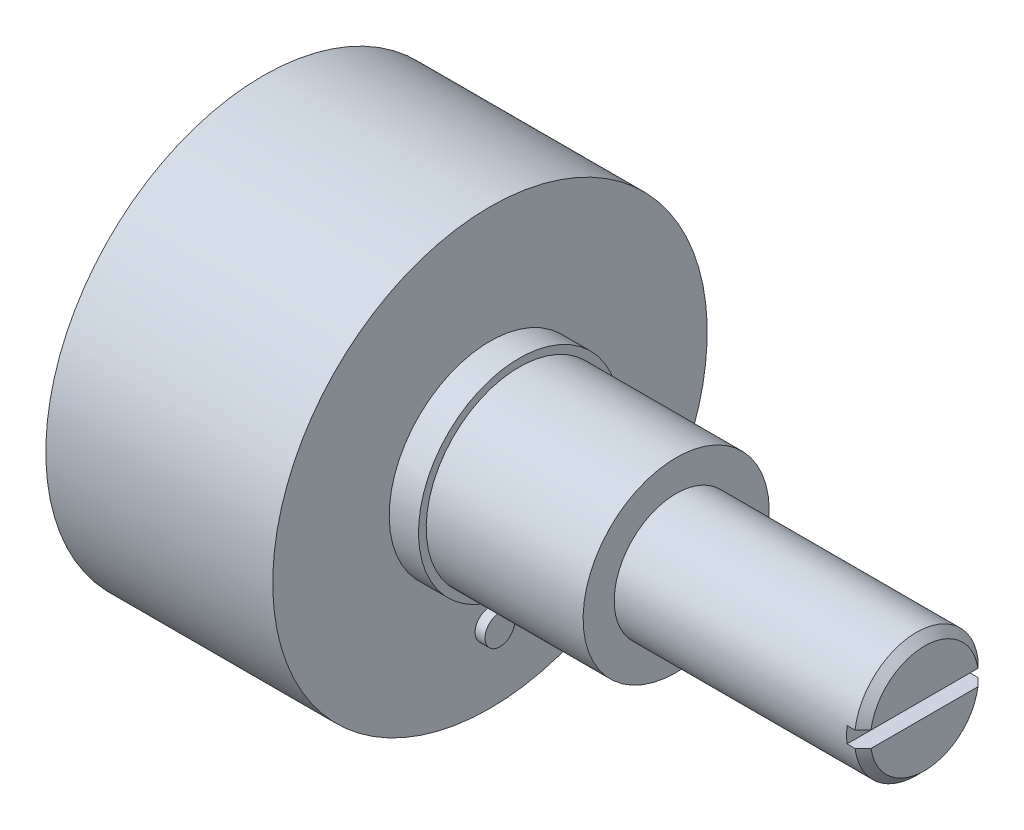
ISO-10303-21;
HEADER;
FILE_DESCRIPTION(('STEP AP214'),'2;1');
FILE_NAME('part.step','',(''),(''),'','','');
FILE_SCHEMA(('AUTOMOTIVE_DESIGN { 1 0 10303 214 1 1 1 1 }'));
ENDSEC;
DATA;
#1=APPLICATION_CONTEXT('core data for automotive mechanical design processes');
#2=APPLICATION_PROTOCOL_DEFINITION('international standard','automotive_design',2000,#1);
#3=PRODUCT_CONTEXT('',#1,'mechanical');
#4=PRODUCT('Part','Part','',(#3));
#5=PRODUCT_RELATED_PRODUCT_CATEGORY('part','',(#4));
#6=PRODUCT_DEFINITION_FORMATION('','',#4);
#7=PRODUCT_DEFINITION_CONTEXT('part definition',#1,'design');
#8=PRODUCT_DEFINITION('design','',#6,#7);
#9=PRODUCT_DEFINITION_SHAPE('','',#8);
#10=(LENGTH_UNIT() NAMED_UNIT(*) SI_UNIT(.MILLI.,.METRE.));
#11=(NAMED_UNIT(*) PLANE_ANGLE_UNIT() SI_UNIT($,.RADIAN.));
#12=(NAMED_UNIT(*) SI_UNIT($,.STERADIAN.) SOLID_ANGLE_UNIT());
#13=UNCERTAINTY_MEASURE_WITH_UNIT(LENGTH_MEASURE(1.E-05),#10,'distance_accuracy_value','');
#14=(GEOMETRIC_REPRESENTATION_CONTEXT(3) GLOBAL_UNCERTAINTY_ASSIGNED_CONTEXT((#13)) GLOBAL_UNIT_ASSIGNED_CONTEXT((#10,
#11,#12)) REPRESENTATION_CONTEXT('',''));
#15=CARTESIAN_POINT('',(0.,0.,0.));
#16=DIRECTION('',(0.,0.,1.));
#17=DIRECTION('',(1.,0.,0.));
#18=AXIS2_PLACEMENT_3D('',#15,#16,#17);
#19=CARTESIAN_POINT('',(22.225,0.,0.));
#20=DIRECTION('',(-1.,0.,0.));
#21=DIRECTION('',(0.,-1.,0.));
#22=AXIS2_PLACEMENT_3D('',#19,#20,#21);
#23=PLANE('',#22);
#24=DIRECTION('',(0.,0.,1.));
#25=VECTOR('',#24,1.);
#26=CARTESIAN_POINT('',(22.225,-0.4064,0.));
#27=LINE('',#26,#25);
#28=CARTESIAN_POINT('',(22.225,-0.4064,-2.73475826794622));
#29=VERTEX_POINT('',#28);
#30=CARTESIAN_POINT('',(22.225,-0.4064,2.73475826794622));
#31=VERTEX_POINT('',#30);
#32=EDGE_CURVE('E175',#29,#31,#27,.T.);
#33=ORIENTED_EDGE('',*,*,#32,.T.);
#34=CARTESIAN_POINT('',(22.225,0.,0.));
#35=DIRECTION('',(-1.,0.,0.));
#36=DIRECTION('',(0.,-1.,0.));
#37=AXIS2_PLACEMENT_3D('',#34,#35,#36);
#38=CIRCLE('',#37,2.76479000000004);
#39=EDGE_CURVE('E230',#31,#29,#38,.F.);
#40=ORIENTED_EDGE('',*,*,#39,.T.);
#41=EDGE_LOOP('',(#33,#40));
#42=FACE_BOUND('',#41,.T.);
#43=ADVANCED_FACE('F45',(#42),#23,.F.);
#44=CARTESIAN_POINT('',(-11.6078,0.,0.));
#45=DIRECTION('',(1.,0.,0.));
#46=DIRECTION('',(0.,1.,0.));
#47=AXIS2_PLACEMENT_3D('',#44,#45,#46);
#48=PLANE('',#47);
#49=CARTESIAN_POINT('',(-11.6078,0.,0.));
#50=DIRECTION('',(-1.,0.,0.));
#51=DIRECTION('',(0.,-1.,0.));
#52=AXIS2_PLACEMENT_3D('',#49,#50,#51);
#53=CIRCLE('',#52,11.1125);
#54=CARTESIAN_POINT('',(-11.6078,-11.1125000000001,0.));
#55=VERTEX_POINT('',#54);
#56=EDGE_CURVE('E164',#55,#55,#53,.T.);
#57=ORIENTED_EDGE('',*,*,#56,.T.);
#58=EDGE_LOOP('',(#57));
#59=FACE_BOUND('',#58,.T.);
#60=ADVANCED_FACE('F247',(#59),#48,.F.);
#61=CARTESIAN_POINT('',(22.225,0.,0.));
#62=DIRECTION('',(-1.,0.,0.));
#63=DIRECTION('',(0.,-1.,0.));
#64=AXIS2_PLACEMENT_3D('',#61,#62,#63);
#65=CYLINDRICAL_SURFACE('',#64,11.1125);
#66=ORIENTED_EDGE('',*,*,#56,.F.);
#67=EDGE_LOOP('',(#66));
#68=FACE_BOUND('',#67,.T.);
#69=CARTESIAN_POINT('',(0.,0.,0.));
#70=DIRECTION('',(-1.,0.,0.));
#71=DIRECTION('',(0.,-1.,0.));
#72=AXIS2_PLACEMENT_3D('',#69,#70,#71);
#73=CIRCLE('',#72,11.1125);
#74=CARTESIAN_POINT('',(0.,-11.1125000000001,0.));
#75=VERTEX_POINT('',#74);
#76=EDGE_CURVE('E160',#75,#75,#73,.T.);
#77=ORIENTED_EDGE('',*,*,#76,.T.);
#78=EDGE_LOOP('',(#77));
#79=FACE_BOUND('',#78,.T.);
#80=ADVANCED_FACE('F253',(#68,#79),#65,.T.);
#81=CARTESIAN_POINT('',(0.,5.1562,0.));
#82=DIRECTION('',(-1.,0.,0.));
#83=DIRECTION('',(0.,-1.,0.));
#84=AXIS2_PLACEMENT_3D('',#81,#82,#83);
#85=PLANE('',#84);
#86=CARTESIAN_POINT('',(0.,-7.366,0.));
#87=DIRECTION('',(-1.,0.,0.));
#88=DIRECTION('',(0.,-1.,0.));
#89=AXIS2_PLACEMENT_3D('',#86,#87,#88);
#90=CIRCLE('',#89,0.762);
#91=CARTESIAN_POINT('',(0.,-8.128,0.));
#92=VERTEX_POINT('',#91);
#93=EDGE_CURVE('E168',#92,#92,#90,.F.);
#94=ORIENTED_EDGE('',*,*,#93,.F.);
#95=EDGE_LOOP('',(#94));
#96=FACE_BOUND('',#95,.T.);
#97=ORIENTED_EDGE('',*,*,#76,.F.);
#98=EDGE_LOOP('',(#97));
#99=FACE_BOUND('',#98,.T.);
#100=CARTESIAN_POINT('',(0.,0.,0.));
#101=DIRECTION('',(-1.,0.,0.));
#102=DIRECTION('',(0.,-1.,0.));
#103=AXIS2_PLACEMENT_3D('',#100,#101,#102);
#104=CIRCLE('',#103,5.15620000000003);
#105=CARTESIAN_POINT('',(0.,-5.15620000000007,0.));
#106=VERTEX_POINT('',#105);
#107=EDGE_CURVE('E156',#106,#106,#104,.T.);
#108=ORIENTED_EDGE('',*,*,#107,.T.);
#109=EDGE_LOOP('',(#108));
#110=FACE_BOUND('',#109,.T.);
#111=ADVANCED_FACE('F283',(#96,#99,#110),#85,.F.);
#112=CARTESIAN_POINT('',(22.225,0.,0.));
#113=DIRECTION('',(-1.,0.,0.));
#114=DIRECTION('',(0.,-1.,0.));
#115=AXIS2_PLACEMENT_3D('',#112,#113,#114);
#116=CYLINDRICAL_SURFACE('',#115,5.15620000000003);
#117=ORIENTED_EDGE('',*,*,#107,.F.);
#118=EDGE_LOOP('',(#117));
#119=FACE_BOUND('',#118,.T.);
#120=CARTESIAN_POINT('',(1.49860000000001,0.,0.));
#121=DIRECTION('',(-1.,0.,0.));
#122=DIRECTION('',(0.,-1.,0.));
#123=AXIS2_PLACEMENT_3D('',#120,#121,#122);
#124=CIRCLE('',#123,5.15620000000003);
#125=CARTESIAN_POINT('',(1.49860000000001,-5.15620000000006,0.));
#126=VERTEX_POINT('',#125);
#127=EDGE_CURVE('E152',#126,#126,#124,.T.);
#128=ORIENTED_EDGE('',*,*,#127,.T.);
#129=EDGE_LOOP('',(#128));
#130=FACE_BOUND('',#129,.T.);
#131=ADVANCED_FACE('F279',(#119,#130),#116,.T.);
#132=CARTESIAN_POINT('',(1.4986,4.7625,0.));
#133=DIRECTION('',(-1.,0.,0.));
#134=DIRECTION('',(0.,-1.,0.));
#135=AXIS2_PLACEMENT_3D('',#132,#133,#134);
#136=PLANE('',#135);
#137=ORIENTED_EDGE('',*,*,#127,.F.);
#138=EDGE_LOOP('',(#137));
#139=FACE_BOUND('',#138,.T.);
#140=CARTESIAN_POINT('',(1.4986,0.,0.));
#141=DIRECTION('',(-1.,0.,0.));
#142=DIRECTION('',(0.,-1.,0.));
#143=AXIS2_PLACEMENT_3D('',#140,#141,#142);
#144=CIRCLE('',#143,4.76250000000003);
#145=CARTESIAN_POINT('',(1.4986,-4.76250000000006,0.));
#146=VERTEX_POINT('',#145);
#147=EDGE_CURVE('E148',#146,#146,#144,.T.);
#148=ORIENTED_EDGE('',*,*,#147,.T.);
#149=EDGE_LOOP('',(#148));
#150=FACE_BOUND('',#149,.T.);
#151=ADVANCED_FACE('F275',(#139,#150),#136,.F.);
#152=CARTESIAN_POINT('',(22.225,0.,0.));
#153=DIRECTION('',(-1.,0.,0.));
#154=DIRECTION('',(0.,-1.,0.));
#155=AXIS2_PLACEMENT_3D('',#152,#153,#154);
#156=CYLINDRICAL_SURFACE('',#155,4.76250000000003);
#157=ORIENTED_EDGE('',*,*,#147,.F.);
#158=EDGE_LOOP('',(#157));
#159=FACE_BOUND('',#158,.T.);
#160=CARTESIAN_POINT('',(9.52500000000001,0.,0.));
#161=DIRECTION('',(-1.,0.,0.));
#162=DIRECTION('',(0.,-1.,0.));
#163=AXIS2_PLACEMENT_3D('',#160,#161,#162);
#164=CIRCLE('',#163,4.76250000000003);
#165=CARTESIAN_POINT('',(9.52500000000001,-4.76250000000006,0.));
#166=VERTEX_POINT('',#165);
#167=EDGE_CURVE('E144',#166,#166,#164,.T.);
#168=ORIENTED_EDGE('',*,*,#167,.T.);
#169=EDGE_LOOP('',(#168));
#170=FACE_BOUND('',#169,.T.);
#171=ADVANCED_FACE('F268',(#159,#170),#156,.T.);
#172=CARTESIAN_POINT('',(9.525,3.17119,0.));
#173=DIRECTION('',(-1.,0.,0.));
#174=DIRECTION('',(0.,-1.,0.));
#175=AXIS2_PLACEMENT_3D('',#172,#173,#174);
#176=PLANE('',#175);
#177=ORIENTED_EDGE('',*,*,#167,.F.);
#178=EDGE_LOOP('',(#177));
#179=FACE_BOUND('',#178,.T.);
#180=CARTESIAN_POINT('',(9.525,0.,0.));
#181=DIRECTION('',(-1.,0.,0.));
#182=DIRECTION('',(0.,-1.,0.));
#183=AXIS2_PLACEMENT_3D('',#180,#181,#182);
#184=CIRCLE('',#183,3.17119000000003);
#185=CARTESIAN_POINT('',(9.525,-3.17119000000006,0.));
#186=VERTEX_POINT('',#185);
#187=EDGE_CURVE('E140',#186,#186,#184,.T.);
#188=ORIENTED_EDGE('',*,*,#187,.T.);
#189=EDGE_LOOP('',(#188));
#190=FACE_BOUND('',#189,.T.);
#191=ADVANCED_FACE('F263',(#179,#190),#176,.F.);
#192=CARTESIAN_POINT('',(22.225,0.,0.));
#193=DIRECTION('',(-1.,0.,0.));
#194=DIRECTION('',(0.,-1.,0.));
#195=AXIS2_PLACEMENT_3D('',#192,#193,#194);
#196=CYLINDRICAL_SURFACE('',#195,3.17119000000003);
#197=ORIENTED_EDGE('',*,*,#187,.F.);
#198=EDGE_LOOP('',(#197));
#199=FACE_BOUND('',#198,.T.);
#200=DIRECTION('',(-1.,0.,0.));
#201=VECTOR('',#200,1.);
#202=CARTESIAN_POINT('',(22.225,-0.4064,-3.1450413441003));
#203=LINE('',#202,#201);
#204=CARTESIAN_POINT('',(21.4122,-0.4064,-3.1450413441003));
#205=VERTEX_POINT('',#204);
#206=CARTESIAN_POINT('',(21.8186,-0.4064,-3.1450413441003));
#207=VERTEX_POINT('',#206);
#208=EDGE_CURVE('E108',#205,#207,#203,.F.);
#209=ORIENTED_EDGE('',*,*,#208,.T.);
#210=CARTESIAN_POINT('',(21.8186,0.,0.));
#211=DIRECTION('',(-1.,0.,0.));
#212=DIRECTION('',(0.,-1.,0.));
#213=AXIS2_PLACEMENT_3D('',#210,#211,#212);
#214=CIRCLE('',#213,3.17119000000003);
#215=CARTESIAN_POINT('',(21.8186,-0.4064,3.1450413441003));
#216=VERTEX_POINT('',#215);
#217=EDGE_CURVE('E182',#207,#216,#214,.T.);
#218=ORIENTED_EDGE('',*,*,#217,.T.);
#219=DIRECTION('',(-1.,0.,0.));
#220=VECTOR('',#219,1.);
#221=CARTESIAN_POINT('',(22.225,-0.4064,3.1450413441003));
#222=LINE('',#221,#220);
#223=CARTESIAN_POINT('',(21.4122,-0.4064,3.1450413441003));
#224=VERTEX_POINT('',#223);
#225=EDGE_CURVE('E133',#216,#224,#222,.T.);
#226=ORIENTED_EDGE('',*,*,#225,.T.);
#227=CARTESIAN_POINT('',(21.4122,0.,0.));
#228=DIRECTION('',(-1.,0.,0.));
#229=DIRECTION('',(0.,0.,1.));
#230=AXIS2_PLACEMENT_3D('',#227,#228,#229);
#231=CIRCLE('',#230,3.17119000000003);
#232=CARTESIAN_POINT('',(21.4122,0.4064,3.14504134410029));
#233=VERTEX_POINT('',#232);
#234=EDGE_CURVE('E121',#224,#233,#231,.T.);
#235=ORIENTED_EDGE('',*,*,#234,.T.);
#236=DIRECTION('',(-1.,0.,0.));
#237=VECTOR('',#236,1.);
#238=CARTESIAN_POINT('',(22.225,0.4064,3.14504134410029));
#239=LINE('',#238,#237);
#240=CARTESIAN_POINT('',(21.8186,0.4064,3.14504134410029));
#241=VERTEX_POINT('',#240);
#242=EDGE_CURVE('E109',#233,#241,#239,.F.);
#243=ORIENTED_EDGE('',*,*,#242,.T.);
#244=CARTESIAN_POINT('',(21.8186,0.,0.));
#245=DIRECTION('',(-1.,0.,0.));
#246=DIRECTION('',(0.,-1.,0.));
#247=AXIS2_PLACEMENT_3D('',#244,#245,#246);
#248=CIRCLE('',#247,3.17119000000003);
#249=CARTESIAN_POINT('',(21.8186,0.4064,-3.14504134410029));
#250=VERTEX_POINT('',#249);
#251=EDGE_CURVE('E105',#241,#250,#248,.T.);
#252=ORIENTED_EDGE('',*,*,#251,.T.);
#253=DIRECTION('',(-1.,0.,0.));
#254=VECTOR('',#253,1.);
#255=CARTESIAN_POINT('',(22.225,0.4064,-3.14504134410029));
#256=LINE('',#255,#254);
#257=CARTESIAN_POINT('',(21.4122,0.4064,-3.14504134410029));
#258=VERTEX_POINT('',#257);
#259=EDGE_CURVE('E98',#250,#258,#256,.T.);
#260=ORIENTED_EDGE('',*,*,#259,.T.);
#261=EDGE_CURVE('E102',#258,#205,#231,.T.);
#262=ORIENTED_EDGE('',*,*,#261,.T.);
#263=EDGE_LOOP('',(#209,#218,#226,#235,#243,#252,#260,#262));
#264=FACE_BOUND('',#263,.T.);
#265=ADVANCED_FACE('F101',(#199,#264),#196,.T.);
#266=DIRECTION('',(0.,0.,-1.));
#267=VECTOR('',#266,1.);
#268=CARTESIAN_POINT('',(22.225,0.4064,0.));
#269=LINE('',#268,#267);
#270=CARTESIAN_POINT('',(22.225,0.4064,2.7347582679462));
#271=VERTEX_POINT('',#270);
#272=CARTESIAN_POINT('',(22.225,0.4064,-2.7347582679462));
#273=VERTEX_POINT('',#272);
#274=EDGE_CURVE('E172',#271,#273,#269,.T.);
#275=ORIENTED_EDGE('',*,*,#274,.T.);
#276=CARTESIAN_POINT('',(22.225,0.,0.));
#277=DIRECTION('',(-1.,0.,0.));
#278=DIRECTION('',(0.,-1.,0.));
#279=AXIS2_PLACEMENT_3D('',#276,#277,#278);
#280=CIRCLE('',#279,2.76479000000002);
#281=EDGE_CURVE('E11',#273,#271,#280,.F.);
#282=ORIENTED_EDGE('',*,*,#281,.T.);
#283=EDGE_LOOP('',(#275,#282));
#284=FACE_BOUND('',#283,.T.);
#285=ADVANCED_FACE('F249',(#284),#23,.F.);
#286=CARTESIAN_POINT('',(0.508000000000001,-7.366,0.));
#287=DIRECTION('',(-1.,0.,0.));
#288=DIRECTION('',(0.,-1.,0.));
#289=AXIS2_PLACEMENT_3D('',#286,#287,#288);
#290=CYLINDRICAL_SURFACE('',#289,0.762);
#291=CARTESIAN_POINT('',(0.508000000000001,-7.366,0.));
#292=DIRECTION('',(1.,0.,0.));
#293=DIRECTION('',(0.,1.,0.));
#294=AXIS2_PLACEMENT_3D('',#291,#292,#293);
#295=CIRCLE('',#294,0.762);
#296=CARTESIAN_POINT('',(0.508000000000001,-6.604,0.));
#297=VERTEX_POINT('',#296);
#298=EDGE_CURVE('E136',#297,#297,#295,.T.);
#299=ORIENTED_EDGE('',*,*,#298,.F.);
#300=EDGE_LOOP('',(#299));
#301=FACE_BOUND('',#300,.T.);
#302=ORIENTED_EDGE('',*,*,#93,.T.);
#303=EDGE_LOOP('',(#302));
#304=FACE_BOUND('',#303,.T.);
#305=ADVANCED_FACE('F257',(#301,#304),#290,.T.);
#306=CARTESIAN_POINT('',(0.508000000000001,-7.366,0.));
#307=DIRECTION('',(1.,0.,0.));
#308=DIRECTION('',(0.,1.,0.));
#309=AXIS2_PLACEMENT_3D('',#306,#307,#308);
#310=PLANE('',#309);
#311=ORIENTED_EDGE('',*,*,#298,.T.);
#312=EDGE_LOOP('',(#311));
#313=FACE_BOUND('',#312,.T.);
#314=ADVANCED_FACE('F212',(#313),#310,.T.);
#315=CARTESIAN_POINT('',(21.4122,0.4064,-11.1125));
#316=DIRECTION('',(-1.,0.,0.));
#317=DIRECTION('',(0.,0.,1.));
#318=AXIS2_PLACEMENT_3D('',#315,#316,#317);
#319=PLANE('',#318);
#320=DIRECTION('',(0.,0.,1.));
#321=VECTOR('',#320,1.);
#322=CARTESIAN_POINT('',(21.4122,0.4064,-11.1125));
#323=LINE('',#322,#321);
#324=EDGE_CURVE('E116',#258,#233,#323,.T.);
#325=ORIENTED_EDGE('',*,*,#324,.T.);
#326=ORIENTED_EDGE('',*,*,#234,.F.);
#327=DIRECTION('',(0.,0.,1.));
#328=VECTOR('',#327,1.);
#329=CARTESIAN_POINT('',(21.4122,-0.4064,-11.1125));
#330=LINE('',#329,#328);
#331=EDGE_CURVE('E119',#205,#224,#330,.T.);
#332=ORIENTED_EDGE('',*,*,#331,.F.);
#333=ORIENTED_EDGE('',*,*,#261,.F.);
#334=EDGE_LOOP('',(#325,#326,#332,#333));
#335=FACE_BOUND('',#334,.T.);
#336=ADVANCED_FACE('F114',(#335),#319,.F.);
#337=CARTESIAN_POINT('',(22.225,-0.4064,-11.1125));
#338=DIRECTION('',(0.,-1.,0.));
#339=DIRECTION('',(1.,0.,0.));
#340=AXIS2_PLACEMENT_3D('',#337,#338,#339);
#341=PLANE('',#340);
#342=ORIENTED_EDGE('',*,*,#225,.F.);
#343=CARTESIAN_POINT('',(21.8186,-0.4064,3.1450413441003));
#344=CARTESIAN_POINT('',(21.8863782762554,-0.4064,3.07670534997473));
#345=CARTESIAN_POINT('',(21.9541340807996,-0.4064,3.00834709681875));
#346=CARTESIAN_POINT('',(22.0896007474669,-0.4064,2.87158607143471));
#347=CARTESIAN_POINT('',(22.1573116095894,-0.4064,2.80318329920601));
#348=CARTESIAN_POINT('',(22.225,-0.4064,2.73475826794622));
#349=B_SPLINE_CURVE_WITH_KNOTS('',3,(#343,#344,#345,#346,#347,#348),.UNSPECIFIED.,.F.,.F.,(4,2,
4),(0.,0.288744347850551,0.577488699971142),.UNSPECIFIED.);
#350=EDGE_CURVE('E194',#216,#31,#349,.T.);
#351=ORIENTED_EDGE('',*,*,#350,.T.);
#352=ORIENTED_EDGE('',*,*,#32,.F.);
#353=CARTESIAN_POINT('',(22.225,-0.4064,-2.73475826794622));
#354=CARTESIAN_POINT('',(22.1573116095894,-0.4064,-2.80318329920601));
#355=CARTESIAN_POINT('',(22.0896007474669,-0.4064,-2.87158607143471));
#356=CARTESIAN_POINT('',(21.9541340807996,-0.4064,-3.00834709681875));
#357=CARTESIAN_POINT('',(21.8863782762554,-0.4064,-3.07670534997473));
#358=CARTESIAN_POINT('',(21.8186,-0.4064,-3.1450413441003));
#359=B_SPLINE_CURVE_WITH_KNOTS('',3,(#353,#354,#355,#356,#357,#358),.UNSPECIFIED.,.F.,.F.,(4,2,
4),(0.,0.288744352120592,0.577488699971143),.UNSPECIFIED.);
#360=EDGE_CURVE('E186',#29,#207,#359,.T.);
#361=ORIENTED_EDGE('',*,*,#360,.T.);
#362=ORIENTED_EDGE('',*,*,#208,.F.);
#363=ORIENTED_EDGE('',*,*,#331,.T.);
#364=EDGE_LOOP('',(#342,#351,#352,#361,#362,#363));
#365=FACE_BOUND('',#364,.T.);
#366=ADVANCED_FACE('F204',(#365),#341,.F.);
#367=CARTESIAN_POINT('',(22.225,0.4064,-11.1125));
#368=DIRECTION('',(0.,1.,0.));
#369=DIRECTION('',(-1.,0.,0.));
#370=AXIS2_PLACEMENT_3D('',#367,#368,#369);
#371=PLANE('',#370);
#372=ORIENTED_EDGE('',*,*,#259,.F.);
#373=CARTESIAN_POINT('',(21.8186,0.4064,-3.14504134410029));
#374=CARTESIAN_POINT('',(21.8863782762554,0.4064,-3.07670534997472));
#375=CARTESIAN_POINT('',(21.9541340807996,0.4064,-3.00834709681873));
#376=CARTESIAN_POINT('',(22.0896007474669,0.4064,-2.8715860714347));
#377=CARTESIAN_POINT('',(22.1573116095894,0.4064,-2.80318329920599));
#378=CARTESIAN_POINT('',(22.225,0.4064,-2.7347582679462));
#379=B_SPLINE_CURVE_WITH_KNOTS('',3,(#373,#374,#375,#376,#377,#378),.UNSPECIFIED.,.F.,.F.,(4,2,
4),(0.,0.288744347850563,0.577488699971168),.UNSPECIFIED.);
#380=EDGE_CURVE('E56',#250,#273,#379,.T.);
#381=ORIENTED_EDGE('',*,*,#380,.T.);
#382=ORIENTED_EDGE('',*,*,#274,.F.);
#383=CARTESIAN_POINT('',(22.225,0.4064,2.7347582679462));
#384=CARTESIAN_POINT('',(22.1573116095894,0.4064,2.80318329920599));
#385=CARTESIAN_POINT('',(22.0896007474669,0.4064,2.8715860714347));
#386=CARTESIAN_POINT('',(21.9541340807996,0.4064,3.00834709681873));
#387=CARTESIAN_POINT('',(21.8863782762554,0.4064,3.07670534997472));
#388=CARTESIAN_POINT('',(21.8186,0.4064,3.14504134410029));
#389=B_SPLINE_CURVE_WITH_KNOTS('',3,(#383,#384,#385,#386,#387,#388),.UNSPECIFIED.,.F.,.F.,(4,2,
4),(0.,0.288744352120604,0.577488699971168),.UNSPECIFIED.);
#390=EDGE_CURVE('E219',#271,#241,#389,.T.);
#391=ORIENTED_EDGE('',*,*,#390,.T.);
#392=ORIENTED_EDGE('',*,*,#242,.F.);
#393=ORIENTED_EDGE('',*,*,#324,.F.);
#394=EDGE_LOOP('',(#372,#381,#382,#391,#392,#393));
#395=FACE_BOUND('',#394,.T.);
#396=ADVANCED_FACE('F123',(#395),#371,.F.);
#397=CARTESIAN_POINT('',(21.8186,0.,0.));
#398=DIRECTION('',(-1.,0.,0.));
#399=DIRECTION('',(0.,-1.,0.));
#400=AXIS2_PLACEMENT_3D('',#397,#398,#399);
#401=CONICAL_SURFACE('',#400,3.17119000000003,0.785398163397453);
#402=ORIENTED_EDGE('',*,*,#360,.F.);
#403=ORIENTED_EDGE('',*,*,#39,.F.);
#404=ORIENTED_EDGE('',*,*,#350,.F.);
#405=ORIENTED_EDGE('',*,*,#217,.F.);
#406=EDGE_LOOP('',(#402,#403,#404,#405));
#407=FACE_BOUND('',#406,.T.);
#408=ADVANCED_FACE('F201',(#407),#401,.T.);
#409=CARTESIAN_POINT('',(21.8186,0.,0.));
#410=DIRECTION('',(-1.,0.,0.));
#411=DIRECTION('',(0.,-1.,0.));
#412=AXIS2_PLACEMENT_3D('',#409,#410,#411);
#413=CONICAL_SURFACE('',#412,3.17119000000003,0.785398163397444);
#414=ORIENTED_EDGE('',*,*,#390,.F.);
#415=ORIENTED_EDGE('',*,*,#281,.F.);
#416=ORIENTED_EDGE('',*,*,#380,.F.);
#417=ORIENTED_EDGE('',*,*,#251,.F.);
#418=EDGE_LOOP('',(#414,#415,#416,#417));
#419=FACE_BOUND('',#418,.T.);
#420=ADVANCED_FACE('F48',(#419),#413,.T.);
#421=CLOSED_SHELL('',(#43,#60,#80,#111,#131,#151,#171,#191,#265,#285,#305,#314,#336,#366,#396,
#408,#420));
#422=MANIFOLD_SOLID_BREP('B2',#421);
#423=ADVANCED_BREP_SHAPE_REPRESENTATION('',(#18,#422),#14);
#424=SHAPE_DEFINITION_REPRESENTATION(#9,#423);
ENDSEC;
END-ISO-10303-21;
